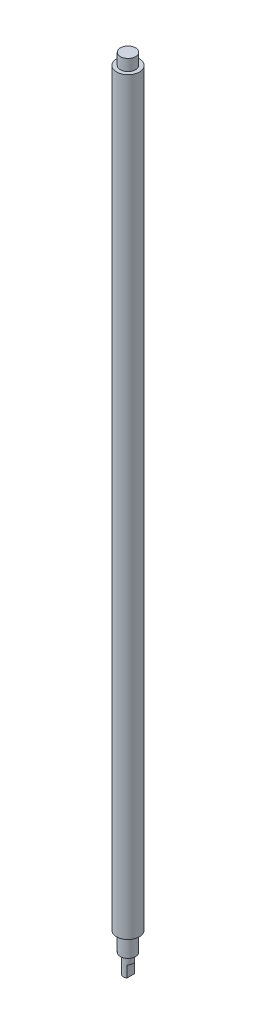
ISO-10303-21;
HEADER;
FILE_DESCRIPTION(('STEP AP214'),'2;1');
FILE_NAME('part.step','',(''),(''),'','','');
FILE_SCHEMA(('AUTOMOTIVE_DESIGN { 1 0 10303 214 1 1 1 1 }'));
ENDSEC;
DATA;
#1=APPLICATION_CONTEXT('core data for automotive mechanical design processes');
#2=APPLICATION_PROTOCOL_DEFINITION('international standard','automotive_design',2000,#1);
#3=PRODUCT_CONTEXT('',#1,'mechanical');
#4=PRODUCT('Part','Part','',(#3));
#5=PRODUCT_RELATED_PRODUCT_CATEGORY('part','',(#4));
#6=PRODUCT_DEFINITION_FORMATION('','',#4);
#7=PRODUCT_DEFINITION_CONTEXT('part definition',#1,'design');
#8=PRODUCT_DEFINITION('design','',#6,#7);
#9=PRODUCT_DEFINITION_SHAPE('','',#8);
#10=(LENGTH_UNIT() NAMED_UNIT(*) SI_UNIT(.MILLI.,.METRE.));
#11=(NAMED_UNIT(*) PLANE_ANGLE_UNIT() SI_UNIT($,.RADIAN.));
#12=(NAMED_UNIT(*) SI_UNIT($,.STERADIAN.) SOLID_ANGLE_UNIT());
#13=UNCERTAINTY_MEASURE_WITH_UNIT(LENGTH_MEASURE(1.E-05),#10,'distance_accuracy_value','');
#14=(GEOMETRIC_REPRESENTATION_CONTEXT(3) GLOBAL_UNCERTAINTY_ASSIGNED_CONTEXT((#13)) GLOBAL_UNIT_ASSIGNED_CONTEXT((#10,
#11,#12)) REPRESENTATION_CONTEXT('',''));
#15=CARTESIAN_POINT('',(0.,0.,0.));
#16=DIRECTION('',(0.,0.,1.));
#17=DIRECTION('',(1.,0.,0.));
#18=AXIS2_PLACEMENT_3D('',#15,#16,#17);
#19=CARTESIAN_POINT('',(0.,10.,0.));
#20=DIRECTION('',(0.,-1.,0.));
#21=DIRECTION('',(0.,0.,-1.));
#22=AXIS2_PLACEMENT_3D('',#19,#20,#21);
#23=CYLINDRICAL_SURFACE('',#22,2.5);
#24=CARTESIAN_POINT('',(0.,10.,0.));
#25=DIRECTION('',(0.,1.,0.));
#26=DIRECTION('',(0.,0.,1.));
#27=AXIS2_PLACEMENT_3D('',#24,#25,#26);
#28=CIRCLE('',#27,2.5);
#29=CARTESIAN_POINT('',(0.,10.,2.5));
#30=VERTEX_POINT('',#29);
#31=EDGE_CURVE('E88',#30,#30,#28,.T.);
#32=ORIENTED_EDGE('',*,*,#31,.F.);
#33=EDGE_LOOP('',(#32));
#34=FACE_BOUND('',#33,.T.);
#35=DIRECTION('',(0.,-1.,0.));
#36=VECTOR('',#35,1.);
#37=CARTESIAN_POINT('',(1.5,6.,2.));
#38=LINE('',#37,#36);
#39=CARTESIAN_POINT('',(1.5,6.,2.));
#40=VERTEX_POINT('',#39);
#41=CARTESIAN_POINT('',(1.5,0.,2.));
#42=VERTEX_POINT('',#41);
#43=EDGE_CURVE('E61',#40,#42,#38,.T.);
#44=ORIENTED_EDGE('',*,*,#43,.F.);
#45=CARTESIAN_POINT('',(0.,6.,0.));
#46=DIRECTION('',(0.,1.,0.));
#47=DIRECTION('',(0.,0.,1.));
#48=AXIS2_PLACEMENT_3D('',#45,#46,#47);
#49=CIRCLE('',#48,2.5);
#50=CARTESIAN_POINT('',(1.5,6.,-2.));
#51=VERTEX_POINT('',#50);
#52=EDGE_CURVE('E83',#40,#51,#49,.T.);
#53=ORIENTED_EDGE('',*,*,#52,.T.);
#54=DIRECTION('',(0.,-1.,0.));
#55=VECTOR('',#54,1.);
#56=CARTESIAN_POINT('',(1.5,6.,-2.));
#57=LINE('',#56,#55);
#58=CARTESIAN_POINT('',(1.5,0.,-2.));
#59=VERTEX_POINT('',#58);
#60=EDGE_CURVE('E67',#51,#59,#57,.T.);
#61=ORIENTED_EDGE('',*,*,#60,.T.);
#62=CARTESIAN_POINT('',(0.,0.,0.));
#63=DIRECTION('',(0.,1.,0.));
#64=DIRECTION('',(0.,0.,1.));
#65=AXIS2_PLACEMENT_3D('',#62,#63,#64);
#66=CIRCLE('',#65,2.5);
#67=EDGE_CURVE('E82',#59,#42,#66,.T.);
#68=ORIENTED_EDGE('',*,*,#67,.T.);
#69=EDGE_LOOP('',(#44,#53,#61,#68));
#70=FACE_BOUND('',#69,.T.);
#71=ADVANCED_FACE('F45',(#34,#70),#23,.T.);
#72=CARTESIAN_POINT('',(0.,0.,0.));
#73=DIRECTION('',(0.,1.,0.));
#74=DIRECTION('',(0.,0.,1.));
#75=AXIS2_PLACEMENT_3D('',#72,#73,#74);
#76=PLANE('',#75);
#77=DIRECTION('',(0.,0.,1.));
#78=VECTOR('',#77,1.);
#79=CARTESIAN_POINT('',(1.5,0.,0.));
#80=LINE('',#79,#78);
#81=EDGE_CURVE('E72',#59,#42,#80,.T.);
#82=ORIENTED_EDGE('',*,*,#81,.T.);
#83=ORIENTED_EDGE('',*,*,#67,.F.);
#84=EDGE_LOOP('',(#82,#83));
#85=FACE_BOUND('',#84,.T.);
#86=ADVANCED_FACE('F86',(#85),#76,.F.);
#87=CARTESIAN_POINT('',(0.,420.,0.));
#88=DIRECTION('',(0.,-1.,0.));
#89=DIRECTION('',(0.,0.,-1.));
#90=AXIS2_PLACEMENT_3D('',#87,#88,#89);
#91=CYLINDRICAL_SURFACE('',#90,4.);
#92=CARTESIAN_POINT('',(0.,414.,0.));
#93=DIRECTION('',(0.,1.,0.));
#94=DIRECTION('',(0.,0.,1.));
#95=AXIS2_PLACEMENT_3D('',#92,#93,#94);
#96=CIRCLE('',#95,4.);
#97=CARTESIAN_POINT('',(0.,414.,4.));
#98=VERTEX_POINT('',#97);
#99=EDGE_CURVE('E106',#98,#98,#96,.T.);
#100=ORIENTED_EDGE('',*,*,#99,.T.);
#101=EDGE_LOOP('',(#100));
#102=FACE_BOUND('',#101,.T.);
#103=CARTESIAN_POINT('',(0.,420.,0.));
#104=DIRECTION('',(0.,1.,0.));
#105=DIRECTION('',(0.,0.,1.));
#106=AXIS2_PLACEMENT_3D('',#103,#104,#105);
#107=CIRCLE('',#106,4.);
#108=CARTESIAN_POINT('',(0.,420.,4.));
#109=VERTEX_POINT('',#108);
#110=EDGE_CURVE('E11',#109,#109,#107,.T.);
#111=ORIENTED_EDGE('',*,*,#110,.F.);
#112=EDGE_LOOP('',(#111));
#113=FACE_BOUND('',#112,.T.);
#114=ADVANCED_FACE('F47',(#102,#113),#91,.T.);
#115=CARTESIAN_POINT('',(0.,420.,0.));
#116=DIRECTION('',(0.,1.,0.));
#117=DIRECTION('',(0.,0.,1.));
#118=AXIS2_PLACEMENT_3D('',#115,#116,#117);
#119=PLANE('',#118);
#120=ORIENTED_EDGE('',*,*,#110,.T.);
#121=EDGE_LOOP('',(#120));
#122=FACE_BOUND('',#121,.T.);
#123=ADVANCED_FACE('F117',(#122),#119,.T.);
#124=CARTESIAN_POINT('',(0.,414.,0.));
#125=DIRECTION('',(0.,-1.,0.));
#126=DIRECTION('',(0.,0.,-1.));
#127=AXIS2_PLACEMENT_3D('',#124,#125,#126);
#128=CYLINDRICAL_SURFACE('',#127,6.);
#129=CARTESIAN_POINT('',(0.,20.,0.));
#130=DIRECTION('',(0.,1.,0.));
#131=DIRECTION('',(0.,0.,1.));
#132=AXIS2_PLACEMENT_3D('',#129,#130,#131);
#133=CIRCLE('',#132,6.);
#134=CARTESIAN_POINT('',(0.,20.,6.));
#135=VERTEX_POINT('',#134);
#136=EDGE_CURVE('E102',#135,#135,#133,.T.);
#137=ORIENTED_EDGE('',*,*,#136,.T.);
#138=EDGE_LOOP('',(#137));
#139=FACE_BOUND('',#138,.T.);
#140=CARTESIAN_POINT('',(0.,414.,0.));
#141=DIRECTION('',(0.,1.,0.));
#142=DIRECTION('',(0.,0.,1.));
#143=AXIS2_PLACEMENT_3D('',#140,#141,#142);
#144=CIRCLE('',#143,6.);
#145=CARTESIAN_POINT('',(0.,414.,6.));
#146=VERTEX_POINT('',#145);
#147=EDGE_CURVE('E54',#146,#146,#144,.T.);
#148=ORIENTED_EDGE('',*,*,#147,.F.);
#149=EDGE_LOOP('',(#148));
#150=FACE_BOUND('',#149,.T.);
#151=ADVANCED_FACE('F115',(#139,#150),#128,.T.);
#152=CARTESIAN_POINT('',(0.,414.,0.));
#153=DIRECTION('',(0.,1.,0.));
#154=DIRECTION('',(0.,0.,1.));
#155=AXIS2_PLACEMENT_3D('',#152,#153,#154);
#156=PLANE('',#155);
#157=ORIENTED_EDGE('',*,*,#99,.F.);
#158=EDGE_LOOP('',(#157));
#159=FACE_BOUND('',#158,.T.);
#160=ORIENTED_EDGE('',*,*,#147,.T.);
#161=EDGE_LOOP('',(#160));
#162=FACE_BOUND('',#161,.T.);
#163=ADVANCED_FACE('F113',(#159,#162),#156,.T.);
#164=CARTESIAN_POINT('',(0.,20.,0.));
#165=DIRECTION('',(0.,-1.,0.));
#166=DIRECTION('',(0.,0.,-1.));
#167=AXIS2_PLACEMENT_3D('',#164,#165,#166);
#168=CYLINDRICAL_SURFACE('',#167,4.);
#169=CARTESIAN_POINT('',(0.,10.,0.));
#170=DIRECTION('',(0.,1.,0.));
#171=DIRECTION('',(0.,0.,1.));
#172=AXIS2_PLACEMENT_3D('',#169,#170,#171);
#173=CIRCLE('',#172,4.);
#174=CARTESIAN_POINT('',(0.,10.,4.));
#175=VERTEX_POINT('',#174);
#176=EDGE_CURVE('E93',#175,#175,#173,.T.);
#177=ORIENTED_EDGE('',*,*,#176,.T.);
#178=EDGE_LOOP('',(#177));
#179=FACE_BOUND('',#178,.T.);
#180=CARTESIAN_POINT('',(0.,20.,0.));
#181=DIRECTION('',(0.,1.,0.));
#182=DIRECTION('',(0.,0.,1.));
#183=AXIS2_PLACEMENT_3D('',#180,#181,#182);
#184=CIRCLE('',#183,4.);
#185=CARTESIAN_POINT('',(0.,20.,4.));
#186=VERTEX_POINT('',#185);
#187=EDGE_CURVE('E98',#186,#186,#184,.T.);
#188=ORIENTED_EDGE('',*,*,#187,.F.);
#189=EDGE_LOOP('',(#188));
#190=FACE_BOUND('',#189,.T.);
#191=ADVANCED_FACE('F124',(#179,#190),#168,.T.);
#192=CARTESIAN_POINT('',(0.,20.,0.));
#193=DIRECTION('',(0.,1.,0.));
#194=DIRECTION('',(0.,0.,1.));
#195=AXIS2_PLACEMENT_3D('',#192,#193,#194);
#196=PLANE('',#195);
#197=ORIENTED_EDGE('',*,*,#187,.T.);
#198=EDGE_LOOP('',(#197));
#199=FACE_BOUND('',#198,.T.);
#200=ORIENTED_EDGE('',*,*,#136,.F.);
#201=EDGE_LOOP('',(#200));
#202=FACE_BOUND('',#201,.T.);
#203=ADVANCED_FACE('F142',(#199,#202),#196,.F.);
#204=CARTESIAN_POINT('',(0.,10.,0.));
#205=DIRECTION('',(0.,1.,0.));
#206=DIRECTION('',(0.,0.,1.));
#207=AXIS2_PLACEMENT_3D('',#204,#205,#206);
#208=PLANE('',#207);
#209=ORIENTED_EDGE('',*,*,#31,.T.);
#210=EDGE_LOOP('',(#209));
#211=FACE_BOUND('',#210,.T.);
#212=ORIENTED_EDGE('',*,*,#176,.F.);
#213=EDGE_LOOP('',(#212));
#214=FACE_BOUND('',#213,.T.);
#215=ADVANCED_FACE('F140',(#211,#214),#208,.F.);
#216=CARTESIAN_POINT('',(1.5,6.,0.));
#217=DIRECTION('',(1.,0.,0.));
#218=DIRECTION('',(0.,0.,-1.));
#219=AXIS2_PLACEMENT_3D('',#216,#217,#218);
#220=PLANE('',#219);
#221=ORIENTED_EDGE('',*,*,#81,.F.);
#222=ORIENTED_EDGE('',*,*,#60,.F.);
#223=DIRECTION('',(0.,0.,1.));
#224=VECTOR('',#223,1.);
#225=CARTESIAN_POINT('',(1.5,6.,0.));
#226=LINE('',#225,#224);
#227=EDGE_CURVE('E78',#51,#40,#226,.T.);
#228=ORIENTED_EDGE('',*,*,#227,.T.);
#229=ORIENTED_EDGE('',*,*,#43,.T.);
#230=EDGE_LOOP('',(#221,#222,#228,#229));
#231=FACE_BOUND('',#230,.T.);
#232=ADVANCED_FACE('F73',(#231),#220,.T.);
#233=CARTESIAN_POINT('',(0.,6.,0.));
#234=DIRECTION('',(0.,1.,0.));
#235=DIRECTION('',(0.,0.,1.));
#236=AXIS2_PLACEMENT_3D('',#233,#234,#235);
#237=PLANE('',#236);
#238=ORIENTED_EDGE('',*,*,#227,.F.);
#239=ORIENTED_EDGE('',*,*,#52,.F.);
#240=EDGE_LOOP('',(#238,#239));
#241=FACE_BOUND('',#240,.T.);
#242=ADVANCED_FACE('F161',(#241),#237,.F.);
#243=CLOSED_SHELL('',(#71,#86,#114,#123,#151,#163,#191,#203,#215,#232,#242));
#244=MANIFOLD_SOLID_BREP('B2',#243);
#245=ADVANCED_BREP_SHAPE_REPRESENTATION('',(#18,#244),#14);
#246=SHAPE_DEFINITION_REPRESENTATION(#9,#245);
ENDSEC;
END-ISO-10303-21;
